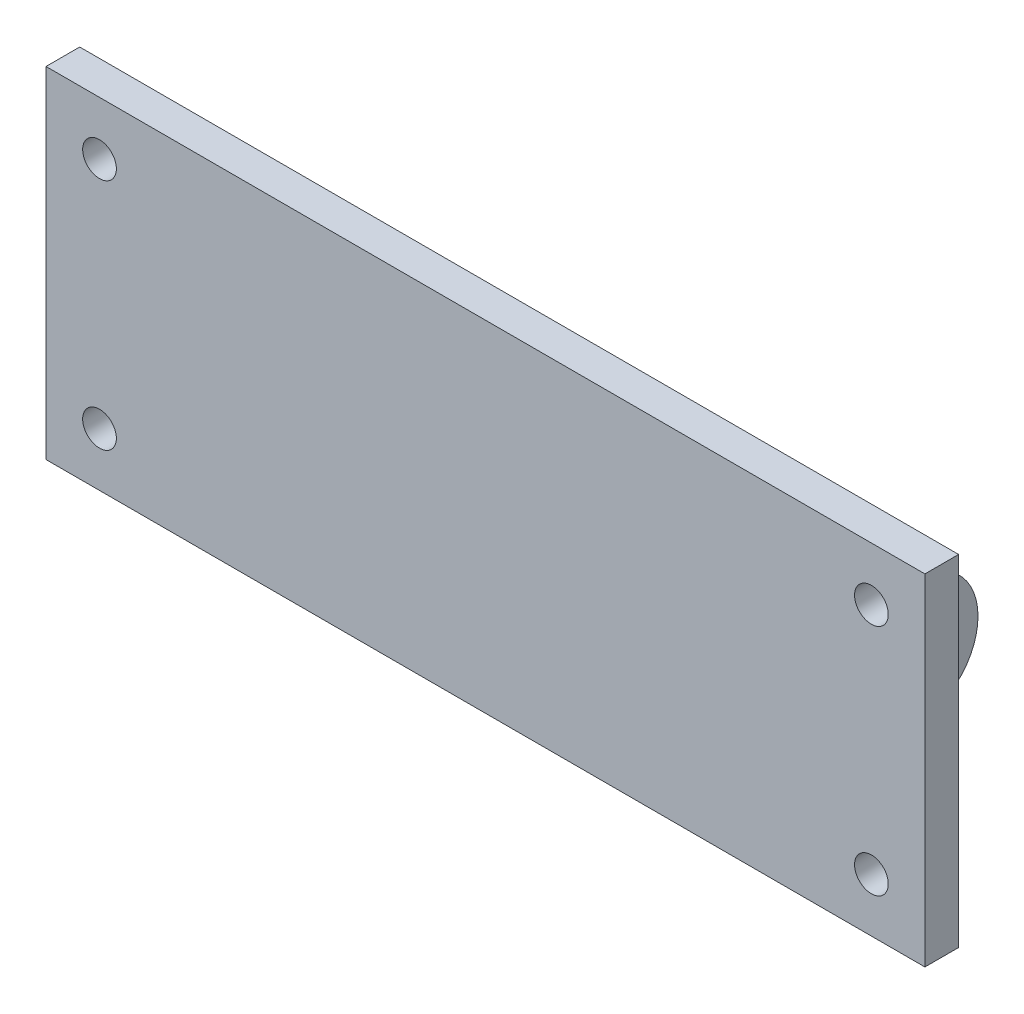
ISO-10303-21;
HEADER;
FILE_DESCRIPTION(('STEP AP214'),'2;1');
FILE_NAME('part.step','',(''),(''),'','','');
FILE_SCHEMA(('AUTOMOTIVE_DESIGN { 1 0 10303 214 1 1 1 1 }'));
ENDSEC;
DATA;
#1=APPLICATION_CONTEXT('core data for automotive mechanical design processes');
#2=APPLICATION_PROTOCOL_DEFINITION('international standard','automotive_design',2000,#1);
#3=PRODUCT_CONTEXT('',#1,'mechanical');
#4=PRODUCT('Part','Part','',(#3));
#5=PRODUCT_RELATED_PRODUCT_CATEGORY('part','',(#4));
#6=PRODUCT_DEFINITION_FORMATION('','',#4);
#7=PRODUCT_DEFINITION_CONTEXT('part definition',#1,'design');
#8=PRODUCT_DEFINITION('design','',#6,#7);
#9=PRODUCT_DEFINITION_SHAPE('','',#8);
#10=(LENGTH_UNIT() NAMED_UNIT(*) SI_UNIT(.MILLI.,.METRE.));
#11=(NAMED_UNIT(*) PLANE_ANGLE_UNIT() SI_UNIT($,.RADIAN.));
#12=(NAMED_UNIT(*) SI_UNIT($,.STERADIAN.) SOLID_ANGLE_UNIT());
#13=UNCERTAINTY_MEASURE_WITH_UNIT(LENGTH_MEASURE(1.E-05),#10,'distance_accuracy_value','');
#14=(GEOMETRIC_REPRESENTATION_CONTEXT(3) GLOBAL_UNCERTAINTY_ASSIGNED_CONTEXT((#13)) GLOBAL_UNIT_ASSIGNED_CONTEXT((#10,
#11,#12)) REPRESENTATION_CONTEXT('',''));
#15=CARTESIAN_POINT('',(0.,0.,0.));
#16=DIRECTION('',(0.,0.,1.));
#17=DIRECTION('',(1.,0.,0.));
#18=AXIS2_PLACEMENT_3D('',#15,#16,#17);
#19=CARTESIAN_POINT('',(0.,0.,0.));
#20=DIRECTION('',(0.,0.,1.));
#21=DIRECTION('',(1.,0.,0.));
#22=AXIS2_PLACEMENT_3D('',#19,#20,#21);
#23=PLANE('',#22);
#24=DIRECTION('',(1.,0.,0.));
#25=VECTOR('',#24,1.);
#26=CARTESIAN_POINT('',(0.,-401.875016109992,0.));
#27=LINE('',#26,#25);
#28=CARTESIAN_POINT('',(80.7443883866232,-401.875016109992,0.));
#29=VERTEX_POINT('',#28);
#30=CARTESIAN_POINT('',(100.744388386623,-401.875016109992,0.));
#31=VERTEX_POINT('',#30);
#32=EDGE_CURVE('E201',#29,#31,#27,.T.);
#33=ORIENTED_EDGE('',*,*,#32,.T.);
#34=DIRECTION('',(0.,-1.,0.));
#35=VECTOR('',#34,1.);
#36=CARTESIAN_POINT('',(100.744388386623,0.,0.));
#37=LINE('',#36,#35);
#38=CARTESIAN_POINT('',(100.744388386623,-361.875016109992,0.));
#39=VERTEX_POINT('',#38);
#40=EDGE_CURVE('E288',#39,#31,#37,.T.);
#41=ORIENTED_EDGE('',*,*,#40,.F.);
#42=DIRECTION('',(1.,0.,0.));
#43=VECTOR('',#42,1.);
#44=CARTESIAN_POINT('',(80.7443883866232,-361.875016109992,0.));
#45=LINE('',#44,#43);
#46=CARTESIAN_POINT('',(80.7443883866232,-361.875016109992,0.));
#47=VERTEX_POINT('',#46);
#48=EDGE_CURVE('E193',#39,#47,#45,.F.);
#49=ORIENTED_EDGE('',*,*,#48,.T.);
#50=DIRECTION('',(0.,-1.,0.));
#51=VECTOR('',#50,1.);
#52=CARTESIAN_POINT('',(80.7443883866232,0.,0.));
#53=LINE('',#52,#51);
#54=EDGE_CURVE('E295',#47,#29,#53,.T.);
#55=ORIENTED_EDGE('',*,*,#54,.T.);
#56=EDGE_LOOP('',(#33,#41,#49,#55));
#57=FACE_BOUND('',#56,.T.);
#58=CARTESIAN_POINT('',(-69.7556116133768,-354.175016109992,0.));
#59=DIRECTION('',(0.,0.,1.));
#60=DIRECTION('',(1.,0.,0.));
#61=AXIS2_PLACEMENT_3D('',#58,#59,#60);
#62=CIRCLE('',#61,4.00000000000001);
#63=CARTESIAN_POINT('',(-65.7556116133768,-354.175016109992,0.));
#64=VERTEX_POINT('',#63);
#65=EDGE_CURVE('E300',#64,#64,#62,.T.);
#66=ORIENTED_EDGE('',*,*,#65,.T.);
#67=EDGE_LOOP('',(#66));
#68=FACE_BOUND('',#67,.T.);
#69=CARTESIAN_POINT('',(113.444388386623,-409.575016109992,0.));
#70=DIRECTION('',(0.,0.,1.));
#71=DIRECTION('',(1.,0.,0.));
#72=AXIS2_PLACEMENT_3D('',#69,#70,#71);
#73=CIRCLE('',#72,4.00000000000001);
#74=CARTESIAN_POINT('',(117.444388386623,-409.575016109992,0.));
#75=VERTEX_POINT('',#74);
#76=EDGE_CURVE('E323',#75,#75,#73,.T.);
#77=ORIENTED_EDGE('',*,*,#76,.T.);
#78=EDGE_LOOP('',(#77));
#79=FACE_BOUND('',#78,.T.);
#80=CARTESIAN_POINT('',(-69.7556116133768,-409.575016109992,0.));
#81=DIRECTION('',(0.,0.,1.));
#82=DIRECTION('',(1.,0.,0.));
#83=AXIS2_PLACEMENT_3D('',#80,#81,#82);
#84=CIRCLE('',#83,4.00000000000001);
#85=CARTESIAN_POINT('',(-65.7556116133768,-409.575016109992,0.));
#86=VERTEX_POINT('',#85);
#87=EDGE_CURVE('E326',#86,#86,#84,.T.);
#88=ORIENTED_EDGE('',*,*,#87,.T.);
#89=EDGE_LOOP('',(#88));
#90=FACE_BOUND('',#89,.T.);
#91=CARTESIAN_POINT('',(113.444388386623,-354.175016109992,0.));
#92=DIRECTION('',(0.,0.,1.));
#93=DIRECTION('',(1.,0.,0.));
#94=AXIS2_PLACEMENT_3D('',#91,#92,#93);
#95=CIRCLE('',#94,4.00000000000001);
#96=CARTESIAN_POINT('',(117.444388386623,-354.175016109992,0.));
#97=VERTEX_POINT('',#96);
#98=EDGE_CURVE('E329',#97,#97,#95,.T.);
#99=ORIENTED_EDGE('',*,*,#98,.T.);
#100=EDGE_LOOP('',(#99));
#101=FACE_BOUND('',#100,.T.);
#102=DIRECTION('',(-1.,0.,0.));
#103=VECTOR('',#102,1.);
#104=CARTESIAN_POINT('',(0.,-341.475016109992,0.));
#105=LINE('',#104,#103);
#106=CARTESIAN_POINT('',(126.144388386623,-341.475016109992,0.));
#107=VERTEX_POINT('',#106);
#108=CARTESIAN_POINT('',(-82.4556116133768,-341.475016109992,0.));
#109=VERTEX_POINT('',#108);
#110=EDGE_CURVE('E189',#107,#109,#105,.T.);
#111=ORIENTED_EDGE('',*,*,#110,.F.);
#112=DIRECTION('',(0.,-1.,0.));
#113=VECTOR('',#112,1.);
#114=CARTESIAN_POINT('',(126.144388386623,0.,0.));
#115=LINE('',#114,#113);
#116=CARTESIAN_POINT('',(126.144388386623,-422.275016109992,0.));
#117=VERTEX_POINT('',#116);
#118=EDGE_CURVE('E310',#107,#117,#115,.T.);
#119=ORIENTED_EDGE('',*,*,#118,.T.);
#120=DIRECTION('',(-1.,0.,0.));
#121=VECTOR('',#120,1.);
#122=CARTESIAN_POINT('',(0.,-422.275016109992,0.));
#123=LINE('',#122,#121);
#124=CARTESIAN_POINT('',(-82.4556116133768,-422.275016109992,0.));
#125=VERTEX_POINT('',#124);
#126=EDGE_CURVE('E335',#117,#125,#123,.T.);
#127=ORIENTED_EDGE('',*,*,#126,.T.);
#128=DIRECTION('',(0.,-1.,0.));
#129=VECTOR('',#128,1.);
#130=CARTESIAN_POINT('',(-82.4556116133768,0.,0.));
#131=LINE('',#130,#129);
#132=EDGE_CURVE('E333',#109,#125,#131,.T.);
#133=ORIENTED_EDGE('',*,*,#132,.F.);
#134=EDGE_LOOP('',(#111,#119,#127,#133));
#135=FACE_BOUND('',#134,.T.);
#136=DIRECTION('',(0.,-1.,0.));
#137=VECTOR('',#136,1.);
#138=CARTESIAN_POINT('',(-37.0556116133768,0.,0.));
#139=LINE('',#138,#137);
#140=CARTESIAN_POINT('',(-37.0556116133768,-361.875016109992,0.));
#141=VERTEX_POINT('',#140);
#142=CARTESIAN_POINT('',(-37.0556116133768,-401.875016109992,0.));
#143=VERTEX_POINT('',#142);
#144=EDGE_CURVE('E267',#141,#143,#139,.T.);
#145=ORIENTED_EDGE('',*,*,#144,.F.);
#146=DIRECTION('',(1.,0.,0.));
#147=VECTOR('',#146,1.);
#148=CARTESIAN_POINT('',(-57.0556116133768,-361.875016109992,0.));
#149=LINE('',#148,#147);
#150=CARTESIAN_POINT('',(-57.0556116133768,-361.875016109992,0.));
#151=VERTEX_POINT('',#150);
#152=EDGE_CURVE('E207',#141,#151,#149,.F.);
#153=ORIENTED_EDGE('',*,*,#152,.T.);
#154=DIRECTION('',(0.,-1.,0.));
#155=VECTOR('',#154,1.);
#156=CARTESIAN_POINT('',(-57.0556116133768,0.,0.));
#157=LINE('',#156,#155);
#158=CARTESIAN_POINT('',(-57.0556116133768,-401.875016109992,0.));
#159=VERTEX_POINT('',#158);
#160=EDGE_CURVE('E283',#151,#159,#157,.T.);
#161=ORIENTED_EDGE('',*,*,#160,.T.);
#162=DIRECTION('',(1.,0.,0.));
#163=VECTOR('',#162,1.);
#164=CARTESIAN_POINT('',(0.,-401.875016109992,0.));
#165=LINE('',#164,#163);
#166=EDGE_CURVE('E204',#159,#143,#165,.T.);
#167=ORIENTED_EDGE('',*,*,#166,.T.);
#168=EDGE_LOOP('',(#145,#153,#161,#167));
#169=FACE_BOUND('',#168,.T.);
#170=ADVANCED_FACE('F39',(#57,#68,#79,#90,#101,#135,#169),#23,.F.);
#171=CARTESIAN_POINT('',(0.,-341.475016109992,8.));
#172=DIRECTION('',(0.,-1.,0.));
#173=DIRECTION('',(0.,0.,-1.));
#174=AXIS2_PLACEMENT_3D('',#171,#172,#173);
#175=PLANE('',#174);
#176=ORIENTED_EDGE('',*,*,#110,.T.);
#177=DIRECTION('',(0.,0.,-1.));
#178=VECTOR('',#177,1.);
#179=CARTESIAN_POINT('',(-82.4556116133768,-341.475016109992,8.));
#180=LINE('',#179,#178);
#181=CARTESIAN_POINT('',(-82.4556116133768,-341.475016109992,8.));
#182=VERTEX_POINT('',#181);
#183=EDGE_CURVE('E170',#182,#109,#180,.T.);
#184=ORIENTED_EDGE('',*,*,#183,.F.);
#185=DIRECTION('',(-1.,0.,0.));
#186=VECTOR('',#185,1.);
#187=CARTESIAN_POINT('',(0.,-341.475016109992,8.));
#188=LINE('',#187,#186);
#189=CARTESIAN_POINT('',(126.144388386623,-341.475016109992,8.));
#190=VERTEX_POINT('',#189);
#191=EDGE_CURVE('E177',#190,#182,#188,.T.);
#192=ORIENTED_EDGE('',*,*,#191,.F.);
#193=DIRECTION('',(0.,0.,-1.));
#194=VECTOR('',#193,1.);
#195=CARTESIAN_POINT('',(126.144388386623,-341.475016109992,8.));
#196=LINE('',#195,#194);
#197=EDGE_CURVE('E320',#190,#107,#196,.T.);
#198=ORIENTED_EDGE('',*,*,#197,.T.);
#199=EDGE_LOOP('',(#176,#184,#192,#198));
#200=FACE_BOUND('',#199,.T.);
#201=ADVANCED_FACE('F187',(#200),#175,.F.);
#202=CARTESIAN_POINT('',(-82.4556116133768,0.,8.));
#203=DIRECTION('',(1.,0.,0.));
#204=DIRECTION('',(0.,0.,-1.));
#205=AXIS2_PLACEMENT_3D('',#202,#203,#204);
#206=PLANE('',#205);
#207=ORIENTED_EDGE('',*,*,#132,.T.);
#208=DIRECTION('',(0.,0.,-1.));
#209=VECTOR('',#208,1.);
#210=CARTESIAN_POINT('',(-82.4556116133768,-422.275016109992,8.));
#211=LINE('',#210,#209);
#212=CARTESIAN_POINT('',(-82.4556116133768,-422.275016109992,8.));
#213=VERTEX_POINT('',#212);
#214=EDGE_CURVE('E172',#213,#125,#211,.T.);
#215=ORIENTED_EDGE('',*,*,#214,.F.);
#216=DIRECTION('',(0.,-1.,0.));
#217=VECTOR('',#216,1.);
#218=CARTESIAN_POINT('',(-82.4556116133768,0.,8.));
#219=LINE('',#218,#217);
#220=EDGE_CURVE('E165',#182,#213,#219,.T.);
#221=ORIENTED_EDGE('',*,*,#220,.F.);
#222=ORIENTED_EDGE('',*,*,#183,.T.);
#223=EDGE_LOOP('',(#207,#215,#221,#222));
#224=FACE_BOUND('',#223,.T.);
#225=ADVANCED_FACE('F168',(#224),#206,.F.);
#226=CARTESIAN_POINT('',(0.,-422.275016109992,8.));
#227=DIRECTION('',(0.,-1.,0.));
#228=DIRECTION('',(0.,0.,-1.));
#229=AXIS2_PLACEMENT_3D('',#226,#227,#228);
#230=PLANE('',#229);
#231=ORIENTED_EDGE('',*,*,#126,.F.);
#232=DIRECTION('',(0.,0.,-1.));
#233=VECTOR('',#232,1.);
#234=CARTESIAN_POINT('',(126.144388386623,-422.275016109992,8.));
#235=LINE('',#234,#233);
#236=CARTESIAN_POINT('',(126.144388386623,-422.275016109992,8.));
#237=VERTEX_POINT('',#236);
#238=EDGE_CURVE('E195',#237,#117,#235,.T.);
#239=ORIENTED_EDGE('',*,*,#238,.F.);
#240=DIRECTION('',(-1.,0.,0.));
#241=VECTOR('',#240,1.);
#242=CARTESIAN_POINT('',(0.,-422.275016109992,8.));
#243=LINE('',#242,#241);
#244=EDGE_CURVE('E176',#237,#213,#243,.T.);
#245=ORIENTED_EDGE('',*,*,#244,.T.);
#246=ORIENTED_EDGE('',*,*,#214,.T.);
#247=EDGE_LOOP('',(#231,#239,#245,#246));
#248=FACE_BOUND('',#247,.T.);
#249=ADVANCED_FACE('F345',(#248),#230,.T.);
#250=CARTESIAN_POINT('',(113.444388386623,-354.175016109992,8.));
#251=DIRECTION('',(0.,0.,-1.));
#252=DIRECTION('',(-1.,0.,0.));
#253=AXIS2_PLACEMENT_3D('',#250,#251,#252);
#254=CYLINDRICAL_SURFACE('',#253,4.00000000000001);
#255=CARTESIAN_POINT('',(113.444388386623,-354.175016109992,8.));
#256=DIRECTION('',(0.,0.,1.));
#257=DIRECTION('',(1.,0.,0.));
#258=AXIS2_PLACEMENT_3D('',#255,#256,#257);
#259=CIRCLE('',#258,4.00000000000001);
#260=CARTESIAN_POINT('',(117.444388386623,-354.175016109992,8.));
#261=VERTEX_POINT('',#260);
#262=EDGE_CURVE('E185',#261,#261,#259,.T.);
#263=ORIENTED_EDGE('',*,*,#262,.T.);
#264=EDGE_LOOP('',(#263));
#265=FACE_BOUND('',#264,.T.);
#266=ORIENTED_EDGE('',*,*,#98,.F.);
#267=EDGE_LOOP('',(#266));
#268=FACE_BOUND('',#267,.T.);
#269=ADVANCED_FACE('F416',(#265,#268),#254,.F.);
#270=CARTESIAN_POINT('',(-69.7556116133768,-409.575016109992,8.));
#271=DIRECTION('',(0.,0.,-1.));
#272=DIRECTION('',(-1.,0.,0.));
#273=AXIS2_PLACEMENT_3D('',#270,#271,#272);
#274=CYLINDRICAL_SURFACE('',#273,4.00000000000001);
#275=CARTESIAN_POINT('',(-69.7556116133768,-409.575016109992,8.));
#276=DIRECTION('',(0.,0.,1.));
#277=DIRECTION('',(1.,0.,0.));
#278=AXIS2_PLACEMENT_3D('',#275,#276,#277);
#279=CIRCLE('',#278,4.00000000000001);
#280=CARTESIAN_POINT('',(-65.7556116133768,-409.575016109992,8.));
#281=VERTEX_POINT('',#280);
#282=EDGE_CURVE('E313',#281,#281,#279,.T.);
#283=ORIENTED_EDGE('',*,*,#282,.T.);
#284=EDGE_LOOP('',(#283));
#285=FACE_BOUND('',#284,.T.);
#286=ORIENTED_EDGE('',*,*,#87,.F.);
#287=EDGE_LOOP('',(#286));
#288=FACE_BOUND('',#287,.T.);
#289=ADVANCED_FACE('F412',(#285,#288),#274,.F.);
#290=CARTESIAN_POINT('',(113.444388386623,-409.575016109992,8.));
#291=DIRECTION('',(0.,0.,-1.));
#292=DIRECTION('',(-1.,0.,0.));
#293=AXIS2_PLACEMENT_3D('',#290,#291,#292);
#294=CYLINDRICAL_SURFACE('',#293,4.00000000000001);
#295=CARTESIAN_POINT('',(113.444388386623,-409.575016109992,8.));
#296=DIRECTION('',(0.,0.,1.));
#297=DIRECTION('',(1.,0.,0.));
#298=AXIS2_PLACEMENT_3D('',#295,#296,#297);
#299=CIRCLE('',#298,4.00000000000001);
#300=CARTESIAN_POINT('',(117.444388386623,-409.575016109992,8.));
#301=VERTEX_POINT('',#300);
#302=EDGE_CURVE('E309',#301,#301,#299,.T.);
#303=ORIENTED_EDGE('',*,*,#302,.T.);
#304=EDGE_LOOP('',(#303));
#305=FACE_BOUND('',#304,.T.);
#306=ORIENTED_EDGE('',*,*,#76,.F.);
#307=EDGE_LOOP('',(#306));
#308=FACE_BOUND('',#307,.T.);
#309=ADVANCED_FACE('F408',(#305,#308),#294,.F.);
#310=CARTESIAN_POINT('',(-69.7556116133768,-354.175016109992,8.));
#311=DIRECTION('',(0.,0.,-1.));
#312=DIRECTION('',(-1.,0.,0.));
#313=AXIS2_PLACEMENT_3D('',#310,#311,#312);
#314=CYLINDRICAL_SURFACE('',#313,4.00000000000001);
#315=CARTESIAN_POINT('',(-69.7556116133768,-354.175016109992,8.));
#316=DIRECTION('',(0.,0.,1.));
#317=DIRECTION('',(1.,0.,0.));
#318=AXIS2_PLACEMENT_3D('',#315,#316,#317);
#319=CIRCLE('',#318,4.00000000000001);
#320=CARTESIAN_POINT('',(-65.7556116133768,-354.175016109992,8.));
#321=VERTEX_POINT('',#320);
#322=EDGE_CURVE('E306',#321,#321,#319,.T.);
#323=ORIENTED_EDGE('',*,*,#322,.T.);
#324=EDGE_LOOP('',(#323));
#325=FACE_BOUND('',#324,.T.);
#326=ORIENTED_EDGE('',*,*,#65,.F.);
#327=EDGE_LOOP('',(#326));
#328=FACE_BOUND('',#327,.T.);
#329=ADVANCED_FACE('F405',(#325,#328),#314,.F.);
#330=CARTESIAN_POINT('',(126.144388386623,0.,8.));
#331=DIRECTION('',(1.,0.,0.));
#332=DIRECTION('',(0.,1.,0.));
#333=AXIS2_PLACEMENT_3D('',#330,#331,#332);
#334=PLANE('',#333);
#335=ORIENTED_EDGE('',*,*,#118,.F.);
#336=ORIENTED_EDGE('',*,*,#197,.F.);
#337=DIRECTION('',(0.,-1.,0.));
#338=VECTOR('',#337,1.);
#339=CARTESIAN_POINT('',(126.144388386623,0.,8.));
#340=LINE('',#339,#338);
#341=EDGE_CURVE('E183',#190,#237,#340,.T.);
#342=ORIENTED_EDGE('',*,*,#341,.T.);
#343=ORIENTED_EDGE('',*,*,#238,.T.);
#344=EDGE_LOOP('',(#335,#336,#342,#343));
#345=FACE_BOUND('',#344,.T.);
#346=ADVANCED_FACE('F343',(#345),#334,.T.);
#347=CARTESIAN_POINT('',(0.,0.,8.));
#348=DIRECTION('',(0.,0.,1.));
#349=DIRECTION('',(1.,0.,0.));
#350=AXIS2_PLACEMENT_3D('',#347,#348,#349);
#351=PLANE('',#350);
#352=ORIENTED_EDGE('',*,*,#322,.F.);
#353=EDGE_LOOP('',(#352));
#354=FACE_BOUND('',#353,.T.);
#355=ORIENTED_EDGE('',*,*,#302,.F.);
#356=EDGE_LOOP('',(#355));
#357=FACE_BOUND('',#356,.T.);
#358=ORIENTED_EDGE('',*,*,#282,.F.);
#359=EDGE_LOOP('',(#358));
#360=FACE_BOUND('',#359,.T.);
#361=ORIENTED_EDGE('',*,*,#262,.F.);
#362=EDGE_LOOP('',(#361));
#363=FACE_BOUND('',#362,.T.);
#364=ORIENTED_EDGE('',*,*,#191,.T.);
#365=ORIENTED_EDGE('',*,*,#220,.T.);
#366=ORIENTED_EDGE('',*,*,#244,.F.);
#367=ORIENTED_EDGE('',*,*,#341,.F.);
#368=EDGE_LOOP('',(#364,#365,#366,#367));
#369=FACE_BOUND('',#368,.T.);
#370=ADVANCED_FACE('F181',(#354,#357,#360,#363,#369),#351,.T.);
#371=CARTESIAN_POINT('',(100.744388386623,0.,-30.));
#372=DIRECTION('',(-1.,0.,0.));
#373=DIRECTION('',(0.,0.,1.));
#374=AXIS2_PLACEMENT_3D('',#371,#372,#373);
#375=PLANE('',#374);
#376=CARTESIAN_POINT('',(100.744388386623,-381.875016109992,-15.));
#377=DIRECTION('',(1.,0.,0.));
#378=DIRECTION('',(0.,1.,0.));
#379=AXIS2_PLACEMENT_3D('',#376,#377,#378);
#380=CIRCLE('',#379,5.);
#381=CARTESIAN_POINT('',(100.744388386623,-376.875016109992,-15.));
#382=VERTEX_POINT('',#381);
#383=EDGE_CURVE('E463',#382,#382,#380,.T.);
#384=ORIENTED_EDGE('',*,*,#383,.F.);
#385=EDGE_LOOP('',(#384));
#386=FACE_BOUND('',#385,.T.);
#387=CARTESIAN_POINT('',(100.744388386623,-381.875016109992,-15.));
#388=DIRECTION('',(-1.,0.,0.));
#389=DIRECTION('',(0.,0.,1.));
#390=AXIS2_PLACEMENT_3D('',#387,#388,#389);
#391=CIRCLE('',#390,15.);
#392=CARTESIAN_POINT('',(100.744388386623,-396.875016109992,-15.));
#393=VERTEX_POINT('',#392);
#394=CARTESIAN_POINT('',(100.744388386623,-381.875016109992,-30.));
#395=VERTEX_POINT('',#394);
#396=EDGE_CURVE('E243',#393,#395,#391,.F.);
#397=ORIENTED_EDGE('',*,*,#396,.T.);
#398=CARTESIAN_POINT('',(100.744388386623,-381.875016109992,-15.));
#399=DIRECTION('',(-1.,0.,0.));
#400=DIRECTION('',(0.,0.,1.));
#401=AXIS2_PLACEMENT_3D('',#398,#399,#400);
#402=CIRCLE('',#401,15.);
#403=CARTESIAN_POINT('',(100.744388386623,-366.875016109992,-15.));
#404=VERTEX_POINT('',#403);
#405=EDGE_CURVE('E245',#395,#404,#402,.F.);
#406=ORIENTED_EDGE('',*,*,#405,.T.);
#407=DIRECTION('',(0.,0.,1.));
#408=VECTOR('',#407,1.);
#409=CARTESIAN_POINT('',(100.744388386623,-366.875016109992,-30.));
#410=LINE('',#409,#408);
#411=CARTESIAN_POINT('',(100.744388386623,-366.875016109992,-5.));
#412=VERTEX_POINT('',#411);
#413=EDGE_CURVE('E297',#404,#412,#410,.T.);
#414=ORIENTED_EDGE('',*,*,#413,.T.);
#415=CARTESIAN_POINT('',(100.744388386623,-361.875016109992,-5.));
#416=DIRECTION('',(-1.,0.,0.));
#417=DIRECTION('',(0.,0.,1.));
#418=AXIS2_PLACEMENT_3D('',#415,#416,#417);
#419=CIRCLE('',#418,5.);
#420=EDGE_CURVE('E237',#412,#39,#419,.T.);
#421=ORIENTED_EDGE('',*,*,#420,.T.);
#422=ORIENTED_EDGE('',*,*,#40,.T.);
#423=CARTESIAN_POINT('',(100.744388386623,-401.875016109992,-5.));
#424=DIRECTION('',(-1.,0.,0.));
#425=DIRECTION('',(0.,0.,1.));
#426=AXIS2_PLACEMENT_3D('',#423,#424,#425);
#427=CIRCLE('',#426,5.);
#428=CARTESIAN_POINT('',(100.744388386623,-396.875016109992,-5.));
#429=VERTEX_POINT('',#428);
#430=EDGE_CURVE('E231',#31,#429,#427,.T.);
#431=ORIENTED_EDGE('',*,*,#430,.T.);
#432=DIRECTION('',(0.,0.,1.));
#433=VECTOR('',#432,1.);
#434=CARTESIAN_POINT('',(100.744388386623,-396.875016109992,-30.));
#435=LINE('',#434,#433);
#436=EDGE_CURVE('E298',#393,#429,#435,.T.);
#437=ORIENTED_EDGE('',*,*,#436,.F.);
#438=EDGE_LOOP('',(#397,#406,#414,#421,#422,#431,#437));
#439=FACE_BOUND('',#438,.T.);
#440=ADVANCED_FACE('F431',(#386,#439),#375,.F.);
#441=CARTESIAN_POINT('',(0.,-396.875016109992,-30.));
#442=DIRECTION('',(0.,-1.,0.));
#443=DIRECTION('',(0.,0.,-1.));
#444=AXIS2_PLACEMENT_3D('',#441,#442,#443);
#445=PLANE('',#444);
#446=DIRECTION('',(0.,0.,1.));
#447=VECTOR('',#446,1.);
#448=CARTESIAN_POINT('',(80.7443883866232,-396.875016109992,-30.));
#449=LINE('',#448,#447);
#450=CARTESIAN_POINT('',(80.7443883866232,-396.875016109992,-15.));
#451=VERTEX_POINT('',#450);
#452=CARTESIAN_POINT('',(80.7443883866232,-396.875016109992,-5.));
#453=VERTEX_POINT('',#452);
#454=EDGE_CURVE('E301',#451,#453,#449,.T.);
#455=ORIENTED_EDGE('',*,*,#454,.F.);
#456=DIRECTION('',(1.,0.,0.));
#457=VECTOR('',#456,1.);
#458=CARTESIAN_POINT('',(100.744388386623,-396.875016109992,-15.));
#459=LINE('',#458,#457);
#460=EDGE_CURVE('E254',#451,#393,#459,.T.);
#461=ORIENTED_EDGE('',*,*,#460,.T.);
#462=ORIENTED_EDGE('',*,*,#436,.T.);
#463=DIRECTION('',(1.,0.,0.));
#464=VECTOR('',#463,1.);
#465=CARTESIAN_POINT('',(0.,-396.875016109992,-5.));
#466=LINE('',#465,#464);
#467=EDGE_CURVE('E213',#429,#453,#466,.F.);
#468=ORIENTED_EDGE('',*,*,#467,.T.);
#469=EDGE_LOOP('',(#455,#461,#462,#468));
#470=FACE_BOUND('',#469,.T.);
#471=ADVANCED_FACE('F435',(#470),#445,.T.);
#472=CARTESIAN_POINT('',(80.7443883866232,0.,-30.));
#473=DIRECTION('',(-1.,0.,0.));
#474=DIRECTION('',(0.,0.,1.));
#475=AXIS2_PLACEMENT_3D('',#472,#473,#474);
#476=PLANE('',#475);
#477=CARTESIAN_POINT('',(80.7443883866232,-381.875016109992,-15.));
#478=DIRECTION('',(-1.,0.,0.));
#479=DIRECTION('',(0.,0.,1.));
#480=AXIS2_PLACEMENT_3D('',#477,#478,#479);
#481=CIRCLE('',#480,5.);
#482=CARTESIAN_POINT('',(80.7443883866232,-376.875016109992,-15.));
#483=VERTEX_POINT('',#482);
#484=EDGE_CURVE('E270',#483,#483,#481,.T.);
#485=ORIENTED_EDGE('',*,*,#484,.F.);
#486=EDGE_LOOP('',(#485));
#487=FACE_BOUND('',#486,.T.);
#488=DIRECTION('',(0.,0.,1.));
#489=VECTOR('',#488,1.);
#490=CARTESIAN_POINT('',(80.7443883866232,-366.875016109992,-30.));
#491=LINE('',#490,#489);
#492=CARTESIAN_POINT('',(80.7443883866232,-366.875016109992,-15.));
#493=VERTEX_POINT('',#492);
#494=CARTESIAN_POINT('',(80.7443883866232,-366.875016109992,-5.));
#495=VERTEX_POINT('',#494);
#496=EDGE_CURVE('E303',#493,#495,#491,.T.);
#497=ORIENTED_EDGE('',*,*,#496,.F.);
#498=CARTESIAN_POINT('',(80.7443883866232,-381.875016109992,-15.));
#499=DIRECTION('',(-1.,0.,0.));
#500=DIRECTION('',(0.,0.,1.));
#501=AXIS2_PLACEMENT_3D('',#498,#499,#500);
#502=CIRCLE('',#501,15.);
#503=CARTESIAN_POINT('',(80.7443883866232,-381.875016109992,-30.));
#504=VERTEX_POINT('',#503);
#505=EDGE_CURVE('E252',#493,#504,#502,.T.);
#506=ORIENTED_EDGE('',*,*,#505,.T.);
#507=CARTESIAN_POINT('',(80.7443883866232,-381.875016109992,-15.));
#508=DIRECTION('',(-1.,0.,0.));
#509=DIRECTION('',(0.,0.,1.));
#510=AXIS2_PLACEMENT_3D('',#507,#508,#509);
#511=CIRCLE('',#510,15.);
#512=EDGE_CURVE('E250',#504,#451,#511,.T.);
#513=ORIENTED_EDGE('',*,*,#512,.T.);
#514=ORIENTED_EDGE('',*,*,#454,.T.);
#515=CARTESIAN_POINT('',(80.7443883866232,-401.875016109992,-5.));
#516=DIRECTION('',(-1.,0.,0.));
#517=DIRECTION('',(0.,0.,1.));
#518=AXIS2_PLACEMENT_3D('',#515,#516,#517);
#519=CIRCLE('',#518,5.);
#520=EDGE_CURVE('E234',#453,#29,#519,.F.);
#521=ORIENTED_EDGE('',*,*,#520,.T.);
#522=ORIENTED_EDGE('',*,*,#54,.F.);
#523=CARTESIAN_POINT('',(80.7443883866232,-361.875016109992,-5.));
#524=DIRECTION('',(-1.,0.,0.));
#525=DIRECTION('',(0.,0.,1.));
#526=AXIS2_PLACEMENT_3D('',#523,#524,#525);
#527=CIRCLE('',#526,5.);
#528=EDGE_CURVE('E240',#47,#495,#527,.F.);
#529=ORIENTED_EDGE('',*,*,#528,.T.);
#530=EDGE_LOOP('',(#497,#506,#513,#514,#521,#522,#529));
#531=FACE_BOUND('',#530,.T.);
#532=ADVANCED_FACE('F440',(#487,#531),#476,.T.);
#533=CARTESIAN_POINT('',(0.,-366.875016109992,-30.));
#534=DIRECTION('',(0.,-1.,0.));
#535=DIRECTION('',(0.,0.,-1.));
#536=AXIS2_PLACEMENT_3D('',#533,#534,#535);
#537=PLANE('',#536);
#538=ORIENTED_EDGE('',*,*,#413,.F.);
#539=DIRECTION('',(1.,0.,0.));
#540=VECTOR('',#539,1.);
#541=CARTESIAN_POINT('',(0.,-366.875016109992,-15.));
#542=LINE('',#541,#540);
#543=EDGE_CURVE('E247',#404,#493,#542,.F.);
#544=ORIENTED_EDGE('',*,*,#543,.T.);
#545=ORIENTED_EDGE('',*,*,#496,.T.);
#546=DIRECTION('',(1.,0.,0.));
#547=VECTOR('',#546,1.);
#548=CARTESIAN_POINT('',(100.744388386623,-366.875016109992,-5.));
#549=LINE('',#548,#547);
#550=EDGE_CURVE('E216',#495,#412,#549,.T.);
#551=ORIENTED_EDGE('',*,*,#550,.T.);
#552=EDGE_LOOP('',(#538,#544,#545,#551));
#553=FACE_BOUND('',#552,.T.);
#554=ADVANCED_FACE('F437',(#553),#537,.F.);
#555=CARTESIAN_POINT('',(-37.0556116133768,0.,-30.));
#556=DIRECTION('',(-1.,0.,0.));
#557=DIRECTION('',(0.,0.,1.));
#558=AXIS2_PLACEMENT_3D('',#555,#556,#557);
#559=PLANE('',#558);
#560=CARTESIAN_POINT('',(-37.0556116133768,-381.875016109992,-15.));
#561=DIRECTION('',(-1.,0.,0.));
#562=DIRECTION('',(0.,0.,1.));
#563=AXIS2_PLACEMENT_3D('',#560,#561,#562);
#564=CIRCLE('',#563,5.);
#565=CARTESIAN_POINT('',(-37.0556116133768,-376.875016109992,-15.));
#566=VERTEX_POINT('',#565);
#567=EDGE_CURVE('E274',#566,#566,#564,.T.);
#568=ORIENTED_EDGE('',*,*,#567,.T.);
#569=EDGE_LOOP('',(#568));
#570=FACE_BOUND('',#569,.T.);
#571=DIRECTION('',(0.,0.,1.));
#572=VECTOR('',#571,1.);
#573=CARTESIAN_POINT('',(-37.0556116133768,-396.875016109992,-30.));
#574=LINE('',#573,#572);
#575=CARTESIAN_POINT('',(-37.0556116133768,-396.875016109992,-15.));
#576=VERTEX_POINT('',#575);
#577=CARTESIAN_POINT('',(-37.0556116133768,-396.875016109992,-5.));
#578=VERTEX_POINT('',#577);
#579=EDGE_CURVE('E286',#576,#578,#574,.T.);
#580=ORIENTED_EDGE('',*,*,#579,.F.);
#581=CARTESIAN_POINT('',(-37.0556116133768,-381.875016109992,-15.));
#582=DIRECTION('',(-1.,0.,0.));
#583=DIRECTION('',(0.,0.,1.));
#584=AXIS2_PLACEMENT_3D('',#581,#582,#583);
#585=CIRCLE('',#584,15.);
#586=CARTESIAN_POINT('',(-37.0556116133768,-381.875016109992,-30.));
#587=VERTEX_POINT('',#586);
#588=EDGE_CURVE('E261',#576,#587,#585,.F.);
#589=ORIENTED_EDGE('',*,*,#588,.T.);
#590=CARTESIAN_POINT('',(-37.0556116133768,-381.875016109992,-15.));
#591=DIRECTION('',(-1.,0.,0.));
#592=DIRECTION('',(0.,0.,1.));
#593=AXIS2_PLACEMENT_3D('',#590,#591,#592);
#594=CIRCLE('',#593,15.);
#595=CARTESIAN_POINT('',(-37.0556116133768,-366.875016109992,-15.));
#596=VERTEX_POINT('',#595);
#597=EDGE_CURVE('E259',#587,#596,#594,.F.);
#598=ORIENTED_EDGE('',*,*,#597,.T.);
#599=DIRECTION('',(0.,0.,1.));
#600=VECTOR('',#599,1.);
#601=CARTESIAN_POINT('',(-37.0556116133768,-366.875016109992,-30.));
#602=LINE('',#601,#600);
#603=CARTESIAN_POINT('',(-37.0556116133768,-366.875016109992,-5.));
#604=VERTEX_POINT('',#603);
#605=EDGE_CURVE('E285',#596,#604,#602,.T.);
#606=ORIENTED_EDGE('',*,*,#605,.T.);
#607=CARTESIAN_POINT('',(-37.0556116133768,-361.875016109992,-5.));
#608=DIRECTION('',(-1.,0.,0.));
#609=DIRECTION('',(0.,0.,1.));
#610=AXIS2_PLACEMENT_3D('',#607,#608,#609);
#611=CIRCLE('',#610,5.);
#612=EDGE_CURVE('E219',#604,#141,#611,.T.);
#613=ORIENTED_EDGE('',*,*,#612,.T.);
#614=ORIENTED_EDGE('',*,*,#144,.T.);
#615=CARTESIAN_POINT('',(-37.0556116133768,-401.875016109992,-5.));
#616=DIRECTION('',(-1.,0.,0.));
#617=DIRECTION('',(0.,0.,1.));
#618=AXIS2_PLACEMENT_3D('',#615,#616,#617);
#619=CIRCLE('',#618,5.);
#620=EDGE_CURVE('E225',#143,#578,#619,.T.);
#621=ORIENTED_EDGE('',*,*,#620,.T.);
#622=EDGE_LOOP('',(#580,#589,#598,#606,#613,#614,#621));
#623=FACE_BOUND('',#622,.T.);
#624=ADVANCED_FACE('F358',(#570,#623),#559,.F.);
#625=CARTESIAN_POINT('',(0.,-396.875016109992,-30.));
#626=DIRECTION('',(0.,-1.,0.));
#627=DIRECTION('',(0.,0.,-1.));
#628=AXIS2_PLACEMENT_3D('',#625,#626,#627);
#629=PLANE('',#628);
#630=DIRECTION('',(0.,0.,1.));
#631=VECTOR('',#630,1.);
#632=CARTESIAN_POINT('',(-57.0556116133768,-396.875016109992,-30.));
#633=LINE('',#632,#631);
#634=CARTESIAN_POINT('',(-57.0556116133768,-396.875016109992,-15.));
#635=VERTEX_POINT('',#634);
#636=CARTESIAN_POINT('',(-57.0556116133768,-396.875016109992,-5.));
#637=VERTEX_POINT('',#636);
#638=EDGE_CURVE('E289',#635,#637,#633,.T.);
#639=ORIENTED_EDGE('',*,*,#638,.F.);
#640=DIRECTION('',(1.,0.,0.));
#641=VECTOR('',#640,1.);
#642=CARTESIAN_POINT('',(-37.0556116133768,-396.875016109992,-15.));
#643=LINE('',#642,#641);
#644=EDGE_CURVE('E256',#635,#576,#643,.T.);
#645=ORIENTED_EDGE('',*,*,#644,.T.);
#646=ORIENTED_EDGE('',*,*,#579,.T.);
#647=DIRECTION('',(1.,0.,0.));
#648=VECTOR('',#647,1.);
#649=CARTESIAN_POINT('',(0.,-396.875016109992,-5.));
#650=LINE('',#649,#648);
#651=EDGE_CURVE('E210',#578,#637,#650,.F.);
#652=ORIENTED_EDGE('',*,*,#651,.T.);
#653=EDGE_LOOP('',(#639,#645,#646,#652));
#654=FACE_BOUND('',#653,.T.);
#655=ADVANCED_FACE('F370',(#654),#629,.T.);
#656=CARTESIAN_POINT('',(-57.0556116133768,0.,-30.));
#657=DIRECTION('',(-1.,0.,0.));
#658=DIRECTION('',(0.,0.,1.));
#659=AXIS2_PLACEMENT_3D('',#656,#657,#658);
#660=PLANE('',#659);
#661=CARTESIAN_POINT('',(-57.0556116133768,-381.875016109992,-15.));
#662=DIRECTION('',(-1.,0.,0.));
#663=DIRECTION('',(0.,0.,1.));
#664=AXIS2_PLACEMENT_3D('',#661,#662,#663);
#665=CIRCLE('',#664,5.);
#666=CARTESIAN_POINT('',(-57.0556116133768,-376.875016109992,-15.));
#667=VERTEX_POINT('',#666);
#668=EDGE_CURVE('E43',#667,#667,#665,.T.);
#669=ORIENTED_EDGE('',*,*,#668,.F.);
#670=EDGE_LOOP('',(#669));
#671=FACE_BOUND('',#670,.T.);
#672=CARTESIAN_POINT('',(-57.0556116133768,-381.875016109992,-15.));
#673=DIRECTION('',(-1.,0.,0.));
#674=DIRECTION('',(0.,0.,1.));
#675=AXIS2_PLACEMENT_3D('',#672,#673,#674);
#676=CIRCLE('',#675,15.);
#677=CARTESIAN_POINT('',(-57.0556116133768,-366.875016109992,-15.));
#678=VERTEX_POINT('',#677);
#679=CARTESIAN_POINT('',(-57.0556116133768,-381.875016109992,-30.));
#680=VERTEX_POINT('',#679);
#681=EDGE_CURVE('E56',#678,#680,#676,.T.);
#682=ORIENTED_EDGE('',*,*,#681,.T.);
#683=CARTESIAN_POINT('',(-57.0556116133768,-381.875016109992,-15.));
#684=DIRECTION('',(-1.,0.,0.));
#685=DIRECTION('',(0.,0.,1.));
#686=AXIS2_PLACEMENT_3D('',#683,#684,#685);
#687=CIRCLE('',#686,15.);
#688=EDGE_CURVE('E48',#680,#635,#687,.T.);
#689=ORIENTED_EDGE('',*,*,#688,.T.);
#690=ORIENTED_EDGE('',*,*,#638,.T.);
#691=CARTESIAN_POINT('',(-57.0556116133768,-401.875016109992,-5.));
#692=DIRECTION('',(-1.,0.,0.));
#693=DIRECTION('',(0.,0.,1.));
#694=AXIS2_PLACEMENT_3D('',#691,#692,#693);
#695=CIRCLE('',#694,5.);
#696=EDGE_CURVE('E228',#637,#159,#695,.F.);
#697=ORIENTED_EDGE('',*,*,#696,.T.);
#698=ORIENTED_EDGE('',*,*,#160,.F.);
#699=CARTESIAN_POINT('',(-57.0556116133768,-361.875016109992,-5.));
#700=DIRECTION('',(-1.,0.,0.));
#701=DIRECTION('',(0.,0.,1.));
#702=AXIS2_PLACEMENT_3D('',#699,#700,#701);
#703=CIRCLE('',#702,5.);
#704=CARTESIAN_POINT('',(-57.0556116133768,-366.875016109992,-5.));
#705=VERTEX_POINT('',#704);
#706=EDGE_CURVE('E222',#151,#705,#703,.F.);
#707=ORIENTED_EDGE('',*,*,#706,.T.);
#708=DIRECTION('',(0.,0.,1.));
#709=VECTOR('',#708,1.);
#710=CARTESIAN_POINT('',(-57.0556116133768,-366.875016109992,-30.));
#711=LINE('',#710,#709);
#712=EDGE_CURVE('E291',#678,#705,#711,.T.);
#713=ORIENTED_EDGE('',*,*,#712,.F.);
#714=EDGE_LOOP('',(#682,#689,#690,#697,#698,#707,#713));
#715=FACE_BOUND('',#714,.T.);
#716=ADVANCED_FACE('F362',(#671,#715),#660,.T.);
#717=CARTESIAN_POINT('',(0.,-366.875016109992,-30.));
#718=DIRECTION('',(0.,-1.,0.));
#719=DIRECTION('',(0.,0.,-1.));
#720=AXIS2_PLACEMENT_3D('',#717,#718,#719);
#721=PLANE('',#720);
#722=ORIENTED_EDGE('',*,*,#605,.F.);
#723=DIRECTION('',(1.,0.,0.));
#724=VECTOR('',#723,1.);
#725=CARTESIAN_POINT('',(0.,-366.875016109992,-15.));
#726=LINE('',#725,#724);
#727=EDGE_CURVE('E11',#596,#678,#726,.F.);
#728=ORIENTED_EDGE('',*,*,#727,.T.);
#729=ORIENTED_EDGE('',*,*,#712,.T.);
#730=DIRECTION('',(1.,0.,0.));
#731=VECTOR('',#730,1.);
#732=CARTESIAN_POINT('',(-37.0556116133768,-366.875016109992,-5.));
#733=LINE('',#732,#731);
#734=EDGE_CURVE('E190',#705,#604,#733,.T.);
#735=ORIENTED_EDGE('',*,*,#734,.T.);
#736=EDGE_LOOP('',(#722,#728,#729,#735));
#737=FACE_BOUND('',#736,.T.);
#738=ADVANCED_FACE('F404',(#737),#721,.F.);
#739=CARTESIAN_POINT('',(0.,-361.875016109992,-5.));
#740=DIRECTION('',(-1.,0.,0.));
#741=DIRECTION('',(0.,0.,1.));
#742=AXIS2_PLACEMENT_3D('',#739,#740,#741);
#743=CYLINDRICAL_SURFACE('',#742,5.);
#744=ORIENTED_EDGE('',*,*,#706,.F.);
#745=ORIENTED_EDGE('',*,*,#152,.F.);
#746=ORIENTED_EDGE('',*,*,#612,.F.);
#747=ORIENTED_EDGE('',*,*,#734,.F.);
#748=EDGE_LOOP('',(#744,#745,#746,#747));
#749=FACE_BOUND('',#748,.T.);
#750=ADVANCED_FACE('F361',(#749),#743,.F.);
#751=CARTESIAN_POINT('',(0.,-401.875016109992,-5.));
#752=DIRECTION('',(1.,0.,0.));
#753=DIRECTION('',(0.,0.,-1.));
#754=AXIS2_PLACEMENT_3D('',#751,#752,#753);
#755=CYLINDRICAL_SURFACE('',#754,5.);
#756=ORIENTED_EDGE('',*,*,#696,.F.);
#757=ORIENTED_EDGE('',*,*,#651,.F.);
#758=ORIENTED_EDGE('',*,*,#620,.F.);
#759=ORIENTED_EDGE('',*,*,#166,.F.);
#760=EDGE_LOOP('',(#756,#757,#758,#759));
#761=FACE_BOUND('',#760,.T.);
#762=ADVANCED_FACE('F367',(#761),#755,.F.);
#763=CARTESIAN_POINT('',(0.,-401.875016109992,-5.));
#764=DIRECTION('',(1.,0.,0.));
#765=DIRECTION('',(0.,0.,-1.));
#766=AXIS2_PLACEMENT_3D('',#763,#764,#765);
#767=CYLINDRICAL_SURFACE('',#766,5.);
#768=ORIENTED_EDGE('',*,*,#520,.F.);
#769=ORIENTED_EDGE('',*,*,#467,.F.);
#770=ORIENTED_EDGE('',*,*,#430,.F.);
#771=ORIENTED_EDGE('',*,*,#32,.F.);
#772=EDGE_LOOP('',(#768,#769,#770,#771));
#773=FACE_BOUND('',#772,.T.);
#774=ADVANCED_FACE('F395',(#773),#767,.F.);
#775=CARTESIAN_POINT('',(0.,-361.875016109992,-5.));
#776=DIRECTION('',(-1.,0.,0.));
#777=DIRECTION('',(0.,0.,1.));
#778=AXIS2_PLACEMENT_3D('',#775,#776,#777);
#779=CYLINDRICAL_SURFACE('',#778,5.);
#780=ORIENTED_EDGE('',*,*,#528,.F.);
#781=ORIENTED_EDGE('',*,*,#48,.F.);
#782=ORIENTED_EDGE('',*,*,#420,.F.);
#783=ORIENTED_EDGE('',*,*,#550,.F.);
#784=EDGE_LOOP('',(#780,#781,#782,#783));
#785=FACE_BOUND('',#784,.T.);
#786=ADVANCED_FACE('F388',(#785),#779,.F.);
#787=CARTESIAN_POINT('',(0.,-381.875016109992,-15.));
#788=DIRECTION('',(-1.,0.,0.));
#789=DIRECTION('',(0.,0.,1.));
#790=AXIS2_PLACEMENT_3D('',#787,#788,#789);
#791=CYLINDRICAL_SURFACE('',#790,15.);
#792=ORIENTED_EDGE('',*,*,#460,.F.);
#793=ORIENTED_EDGE('',*,*,#512,.F.);
#794=DIRECTION('',(1.,0.,0.));
#795=VECTOR('',#794,1.);
#796=CARTESIAN_POINT('',(80.7443883866232,-381.875016109992,-30.));
#797=LINE('',#796,#795);
#798=EDGE_CURVE('E265',#395,#504,#797,.F.);
#799=ORIENTED_EDGE('',*,*,#798,.F.);
#800=ORIENTED_EDGE('',*,*,#396,.F.);
#801=EDGE_LOOP('',(#792,#793,#799,#800));
#802=FACE_BOUND('',#801,.T.);
#803=ADVANCED_FACE('F385',(#802),#791,.T.);
#804=CARTESIAN_POINT('',(0.,-381.875016109992,-15.));
#805=DIRECTION('',(1.,0.,0.));
#806=DIRECTION('',(0.,0.,-1.));
#807=AXIS2_PLACEMENT_3D('',#804,#805,#806);
#808=CYLINDRICAL_SURFACE('',#807,15.);
#809=ORIENTED_EDGE('',*,*,#505,.F.);
#810=ORIENTED_EDGE('',*,*,#543,.F.);
#811=ORIENTED_EDGE('',*,*,#405,.F.);
#812=ORIENTED_EDGE('',*,*,#798,.T.);
#813=EDGE_LOOP('',(#809,#810,#811,#812));
#814=FACE_BOUND('',#813,.T.);
#815=ADVANCED_FACE('F382',(#814),#808,.T.);
#816=CARTESIAN_POINT('',(0.,-381.875016109992,-15.));
#817=DIRECTION('',(1.,0.,0.));
#818=DIRECTION('',(0.,0.,-1.));
#819=AXIS2_PLACEMENT_3D('',#816,#817,#818);
#820=CYLINDRICAL_SURFACE('',#819,15.);
#821=DIRECTION('',(1.,0.,0.));
#822=VECTOR('',#821,1.);
#823=CARTESIAN_POINT('',(0.,-381.875016109992,-30.));
#824=LINE('',#823,#822);
#825=EDGE_CURVE('E268',#680,#587,#824,.T.);
#826=ORIENTED_EDGE('',*,*,#825,.F.);
#827=ORIENTED_EDGE('',*,*,#681,.F.);
#828=ORIENTED_EDGE('',*,*,#727,.F.);
#829=ORIENTED_EDGE('',*,*,#597,.F.);
#830=EDGE_LOOP('',(#826,#827,#828,#829));
#831=FACE_BOUND('',#830,.T.);
#832=ADVANCED_FACE('F41',(#831),#820,.T.);
#833=CARTESIAN_POINT('',(0.,-381.875016109992,-15.));
#834=DIRECTION('',(-1.,0.,0.));
#835=DIRECTION('',(0.,0.,1.));
#836=AXIS2_PLACEMENT_3D('',#833,#834,#835);
#837=CYLINDRICAL_SURFACE('',#836,15.);
#838=ORIENTED_EDGE('',*,*,#688,.F.);
#839=ORIENTED_EDGE('',*,*,#825,.T.);
#840=ORIENTED_EDGE('',*,*,#588,.F.);
#841=ORIENTED_EDGE('',*,*,#644,.F.);
#842=EDGE_LOOP('',(#838,#839,#840,#841));
#843=FACE_BOUND('',#842,.T.);
#844=ADVANCED_FACE('F372',(#843),#837,.T.);
#845=CARTESIAN_POINT('',(-82.4556116133768,-381.875016109992,-15.));
#846=DIRECTION('',(1.,0.,0.));
#847=DIRECTION('',(0.,1.,0.));
#848=AXIS2_PLACEMENT_3D('',#845,#846,#847);
#849=CYLINDRICAL_SURFACE('',#848,5.);
#850=CARTESIAN_POINT('',(-57.0556116133768,-376.875016109992,-15.));
#851=CARTESIAN_POINT('',(-56.8472782800434,-376.875016109992,-15.));
#852=CARTESIAN_POINT('',(-56.6389449467101,-376.875016109992,-15.));
#853=CARTESIAN_POINT('',(-56.2222782800434,-376.875016109992,-15.));
#854=CARTESIAN_POINT('',(-56.0139449467101,-376.875016109992,-15.));
#855=CARTESIAN_POINT('',(-55.5972782800434,-376.875016109992,-15.));
#856=CARTESIAN_POINT('',(-55.3889449467101,-376.875016109992,-15.));
#857=CARTESIAN_POINT('',(-54.9722782800434,-376.875016109992,-15.));
#858=CARTESIAN_POINT('',(-54.7639449467101,-376.875016109992,-15.));
#859=CARTESIAN_POINT('',(-54.3472782800434,-376.875016109992,-15.));
#860=CARTESIAN_POINT('',(-54.1389449467101,-376.875016109992,-15.));
#861=CARTESIAN_POINT('',(-53.7222782800434,-376.875016109992,-15.));
#862=CARTESIAN_POINT('',(-53.5139449467101,-376.875016109992,-15.));
#863=CARTESIAN_POINT('',(-53.0972782800434,-376.875016109992,-15.));
#864=CARTESIAN_POINT('',(-52.8889449467101,-376.875016109992,-15.));
#865=CARTESIAN_POINT('',(-52.4722782800434,-376.875016109992,-15.));
#866=CARTESIAN_POINT('',(-52.2639449467101,-376.875016109992,-15.));
#867=CARTESIAN_POINT('',(-51.8472782800434,-376.875016109992,-15.));
#868=CARTESIAN_POINT('',(-51.6389449467101,-376.875016109992,-15.));
#869=CARTESIAN_POINT('',(-51.2222782800434,-376.875016109992,-15.));
#870=CARTESIAN_POINT('',(-51.0139449467101,-376.875016109992,-15.));
#871=CARTESIAN_POINT('',(-50.5972782800434,-376.875016109992,-15.));
#872=CARTESIAN_POINT('',(-50.3889449467101,-376.875016109992,-15.));
#873=CARTESIAN_POINT('',(-49.9722782800434,-376.875016109992,-15.));
#874=CARTESIAN_POINT('',(-49.7639449467101,-376.875016109992,-15.));
#875=CARTESIAN_POINT('',(-49.3472782800434,-376.875016109992,-15.));
#876=CARTESIAN_POINT('',(-49.1389449467101,-376.875016109992,-15.));
#877=CARTESIAN_POINT('',(-48.7222782800434,-376.875016109992,-15.));
#878=CARTESIAN_POINT('',(-48.5139449467101,-376.875016109992,-15.));
#879=CARTESIAN_POINT('',(-48.0972782800434,-376.875016109992,-15.));
#880=CARTESIAN_POINT('',(-47.8889449467101,-376.875016109992,-15.));
#881=CARTESIAN_POINT('',(-47.4722782800434,-376.875016109992,-15.));
#882=CARTESIAN_POINT('',(-47.2639449467101,-376.875016109992,-15.));
#883=CARTESIAN_POINT('',(-46.8472782800434,-376.875016109992,-15.));
#884=CARTESIAN_POINT('',(-46.6389449467101,-376.875016109992,-15.));
#885=CARTESIAN_POINT('',(-46.2222782800434,-376.875016109992,-15.));
#886=CARTESIAN_POINT('',(-46.0139449467101,-376.875016109992,-15.));
#887=CARTESIAN_POINT('',(-45.5972782800434,-376.875016109992,-15.));
#888=CARTESIAN_POINT('',(-45.3889449467101,-376.875016109992,-15.));
#889=CARTESIAN_POINT('',(-44.9722782800434,-376.875016109992,-15.));
#890=CARTESIAN_POINT('',(-44.7639449467101,-376.875016109992,-15.));
#891=CARTESIAN_POINT('',(-44.3472782800434,-376.875016109992,-15.));
#892=CARTESIAN_POINT('',(-44.1389449467101,-376.875016109992,-15.));
#893=CARTESIAN_POINT('',(-43.7222782800434,-376.875016109992,-15.));
#894=CARTESIAN_POINT('',(-43.5139449467101,-376.875016109992,-15.));
#895=CARTESIAN_POINT('',(-43.0972782800434,-376.875016109992,-15.));
#896=CARTESIAN_POINT('',(-42.8889449467101,-376.875016109992,-15.));
#897=CARTESIAN_POINT('',(-42.4722782800434,-376.875016109992,-15.));
#898=CARTESIAN_POINT('',(-42.2639449467101,-376.875016109992,-15.));
#899=CARTESIAN_POINT('',(-41.8472782800434,-376.875016109992,-15.));
#900=CARTESIAN_POINT('',(-41.6389449467101,-376.875016109992,-15.));
#901=CARTESIAN_POINT('',(-41.2222782800434,-376.875016109992,-15.));
#902=CARTESIAN_POINT('',(-41.0139449467101,-376.875016109992,-15.));
#903=CARTESIAN_POINT('',(-40.5972782800434,-376.875016109992,-15.));
#904=CARTESIAN_POINT('',(-40.3889449467101,-376.875016109992,-15.));
#905=CARTESIAN_POINT('',(-39.9722782800434,-376.875016109992,-15.));
#906=CARTESIAN_POINT('',(-39.7639449467101,-376.875016109992,-15.));
#907=CARTESIAN_POINT('',(-39.3472782800434,-376.875016109992,-15.));
#908=CARTESIAN_POINT('',(-39.1389449467101,-376.875016109992,-15.));
#909=CARTESIAN_POINT('',(-38.7222782800434,-376.875016109992,-15.));
#910=CARTESIAN_POINT('',(-38.5139449467101,-376.875016109992,-15.));
#911=CARTESIAN_POINT('',(-38.0972782800434,-376.875016109992,-15.));
#912=CARTESIAN_POINT('',(-37.8889449467101,-376.875016109992,-15.));
#913=CARTESIAN_POINT('',(-37.4722782800434,-376.875016109992,-15.));
#914=CARTESIAN_POINT('',(-37.2639449467101,-376.875016109992,-15.));
#915=CARTESIAN_POINT('',(-37.0556116133768,-376.875016109992,-15.));
#916=B_SPLINE_CURVE_WITH_KNOTS('',3,(#850,#851,#852,#853,#854,#855,#856,#857,#858,#859,#860,
#861,#862,#863,#864,#865,#866,#867,#868,#869,#870,#871,#872,#873,#874,#875,#876,#877,#878,#879,
#880,#881,#882,#883,#884,#885,#886,#887,#888,#889,#890,#891,#892,#893,#894,#895,#896,#897,#898,
#899,#900,#901,#902,#903,#904,#905,#906,#907,#908,#909,#910,#911,#912,#913,#914,#915),
.UNSPECIFIED.,.F.,.F.,(4,2,2,2,2,2,2,2,2,2,2,2,2,2,2,2,2,2,2,2,2,2,2,2,2,2,2,2,2,2,2,2,4),(0.,
0.625000000000001,1.25,1.875,2.5,3.125,3.75,4.375,5.,5.62500000000001,6.25,6.875,7.5,8.125,8.75,
9.375,10.,10.625,11.25,11.875,12.5,13.125,13.75,14.375,15.,15.625,16.25,16.875,17.5,18.125,
18.75,19.375,20.),.UNSPECIFIED.);
#917=EDGE_CURVE('BSEAM374',#667,#566,#916,.T.);
#918=ORIENTED_EDGE('',*,*,#668,.T.);
#919=ORIENTED_EDGE('',*,*,#567,.F.);
#920=ORIENTED_EDGE('',*,*,#917,.T.);
#921=ORIENTED_EDGE('',*,*,#917,.F.);
#922=EDGE_LOOP('',(#918,#920,#919,#921));
#923=FACE_BOUND('',#922,.T.);
#924=ADVANCED_FACE('F374',(#923),#849,.F.);
#925=CARTESIAN_POINT('',(80.7443883866232,-376.875016109992,-15.));
#926=CARTESIAN_POINT('',(80.9527217199566,-376.875016109992,-15.));
#927=CARTESIAN_POINT('',(81.1610550532899,-376.875016109992,-15.));
#928=CARTESIAN_POINT('',(81.5777217199566,-376.875016109992,-15.));
#929=CARTESIAN_POINT('',(81.7860550532899,-376.875016109992,-15.));
#930=CARTESIAN_POINT('',(82.2027217199566,-376.875016109992,-15.));
#931=CARTESIAN_POINT('',(82.4110550532899,-376.875016109992,-15.));
#932=CARTESIAN_POINT('',(82.8277217199566,-376.875016109992,-15.));
#933=CARTESIAN_POINT('',(83.0360550532899,-376.875016109992,-15.));
#934=CARTESIAN_POINT('',(83.4527217199566,-376.875016109992,-15.));
#935=CARTESIAN_POINT('',(83.6610550532899,-376.875016109992,-15.));
#936=CARTESIAN_POINT('',(84.0777217199566,-376.875016109992,-15.));
#937=CARTESIAN_POINT('',(84.2860550532899,-376.875016109992,-15.));
#938=CARTESIAN_POINT('',(84.7027217199566,-376.875016109992,-15.));
#939=CARTESIAN_POINT('',(84.91105505329,-376.875016109992,-15.));
#940=CARTESIAN_POINT('',(85.3277217199566,-376.875016109992,-15.));
#941=CARTESIAN_POINT('',(85.53605505329,-376.875016109992,-15.));
#942=CARTESIAN_POINT('',(85.9527217199566,-376.875016109992,-15.));
#943=CARTESIAN_POINT('',(86.16105505329,-376.875016109992,-15.));
#944=CARTESIAN_POINT('',(86.5777217199566,-376.875016109992,-15.));
#945=CARTESIAN_POINT('',(86.78605505329,-376.875016109992,-15.));
#946=CARTESIAN_POINT('',(87.2027217199566,-376.875016109992,-15.));
#947=CARTESIAN_POINT('',(87.41105505329,-376.875016109992,-15.));
#948=CARTESIAN_POINT('',(87.8277217199566,-376.875016109992,-15.));
#949=CARTESIAN_POINT('',(88.03605505329,-376.875016109992,-15.));
#950=CARTESIAN_POINT('',(88.4527217199566,-376.875016109992,-15.));
#951=CARTESIAN_POINT('',(88.66105505329,-376.875016109992,-15.));
#952=CARTESIAN_POINT('',(89.0777217199567,-376.875016109992,-15.));
#953=CARTESIAN_POINT('',(89.28605505329,-376.875016109992,-15.));
#954=CARTESIAN_POINT('',(89.7027217199567,-376.875016109992,-15.));
#955=CARTESIAN_POINT('',(89.91105505329,-376.875016109992,-15.));
#956=CARTESIAN_POINT('',(90.3277217199567,-376.875016109992,-15.));
#957=CARTESIAN_POINT('',(90.53605505329,-376.875016109992,-15.));
#958=CARTESIAN_POINT('',(90.9527217199567,-376.875016109992,-15.));
#959=CARTESIAN_POINT('',(91.16105505329,-376.875016109992,-15.));
#960=CARTESIAN_POINT('',(91.5777217199567,-376.875016109992,-15.));
#961=CARTESIAN_POINT('',(91.78605505329,-376.875016109992,-15.));
#962=CARTESIAN_POINT('',(92.2027217199567,-376.875016109992,-15.));
#963=CARTESIAN_POINT('',(92.41105505329,-376.875016109992,-15.));
#964=CARTESIAN_POINT('',(92.8277217199567,-376.875016109992,-15.));
#965=CARTESIAN_POINT('',(93.03605505329,-376.875016109992,-15.));
#966=CARTESIAN_POINT('',(93.4527217199567,-376.875016109992,-15.));
#967=CARTESIAN_POINT('',(93.66105505329,-376.875016109992,-15.));
#968=CARTESIAN_POINT('',(94.0777217199567,-376.875016109992,-15.));
#969=CARTESIAN_POINT('',(94.28605505329,-376.875016109992,-15.));
#970=CARTESIAN_POINT('',(94.7027217199567,-376.875016109992,-15.));
#971=CARTESIAN_POINT('',(94.91105505329,-376.875016109992,-15.));
#972=CARTESIAN_POINT('',(95.3277217199567,-376.875016109992,-15.));
#973=CARTESIAN_POINT('',(95.53605505329,-376.875016109992,-15.));
#974=CARTESIAN_POINT('',(95.9527217199567,-376.875016109992,-15.));
#975=CARTESIAN_POINT('',(96.16105505329,-376.875016109992,-15.));
#976=CARTESIAN_POINT('',(96.5777217199567,-376.875016109992,-15.));
#977=CARTESIAN_POINT('',(96.7860550532901,-376.875016109992,-15.));
#978=CARTESIAN_POINT('',(97.2027217199567,-376.875016109992,-15.));
#979=CARTESIAN_POINT('',(97.4110550532901,-376.875016109992,-15.));
#980=CARTESIAN_POINT('',(97.8277217199567,-376.875016109992,-15.));
#981=CARTESIAN_POINT('',(98.0360550532901,-376.875016109992,-15.));
#982=CARTESIAN_POINT('',(98.4527217199567,-376.875016109992,-15.));
#983=CARTESIAN_POINT('',(98.6610550532901,-376.875016109992,-15.));
#984=CARTESIAN_POINT('',(99.0777217199568,-376.875016109992,-15.));
#985=CARTESIAN_POINT('',(99.2860550532901,-376.875016109992,-15.));
#986=CARTESIAN_POINT('',(99.7027217199568,-376.875016109992,-15.));
#987=CARTESIAN_POINT('',(99.9110550532901,-376.875016109992,-15.));
#988=CARTESIAN_POINT('',(100.327721719957,-376.875016109992,-15.));
#989=CARTESIAN_POINT('',(100.53605505329,-376.875016109992,-15.));
#990=CARTESIAN_POINT('',(100.744388386623,-376.875016109992,-15.));
#991=B_SPLINE_CURVE_WITH_KNOTS('',3,(#925,#926,#927,#928,#929,#930,#931,#932,#933,#934,#935,
#936,#937,#938,#939,#940,#941,#942,#943,#944,#945,#946,#947,#948,#949,#950,#951,#952,#953,#954,
#955,#956,#957,#958,#959,#960,#961,#962,#963,#964,#965,#966,#967,#968,#969,#970,#971,#972,#973,
#974,#975,#976,#977,#978,#979,#980,#981,#982,#983,#984,#985,#986,#987,#988,#989,#990),
.UNSPECIFIED.,.F.,.F.,(4,2,2,2,2,2,2,2,2,2,2,2,2,2,2,2,2,2,2,2,2,2,2,2,2,2,2,2,2,2,2,2,4),(0.,
0.625000000000014,1.25,1.87500000000002,2.50000000000003,3.12500000000002,3.75000000000003,
4.37500000000005,5.00000000000006,5.62500000000005,6.25000000000006,6.87500000000008,
7.50000000000006,8.12500000000008,8.75000000000009,9.37500000000008,10.0000000000001,
10.6250000000001,11.2500000000001,11.8750000000001,12.5000000000001,13.1250000000001,
13.7500000000001,14.3750000000001,15.0000000000001,15.6250000000001,16.2500000000002,
16.8750000000001,17.5000000000002,18.1250000000002,18.7500000000002,19.3750000000002,
20.0000000000002),.UNSPECIFIED.);
#992=EDGE_CURVE('BSEAM379',#483,#382,#991,.T.);
#993=ORIENTED_EDGE('',*,*,#484,.T.);
#994=ORIENTED_EDGE('',*,*,#383,.T.);
#995=ORIENTED_EDGE('',*,*,#992,.T.);
#996=ORIENTED_EDGE('',*,*,#992,.F.);
#997=EDGE_LOOP('',(#993,#995,#994,#996));
#998=FACE_BOUND('',#997,.T.);
#999=ADVANCED_FACE('F379',(#998),#849,.F.);
#1000=CLOSED_SHELL('',(#170,#201,#225,#249,#269,#289,#309,#329,#346,#370,#440,#471,#532,#554,
#624,#655,#716,#738,#750,#762,#774,#786,#803,#815,#832,#844,#924,#999));
#1001=MANIFOLD_SOLID_BREP('B2',#1000);
#1002=ADVANCED_BREP_SHAPE_REPRESENTATION('',(#18,#1001),#14);
#1003=SHAPE_DEFINITION_REPRESENTATION(#9,#1002);
ENDSEC;
END-ISO-10303-21;
